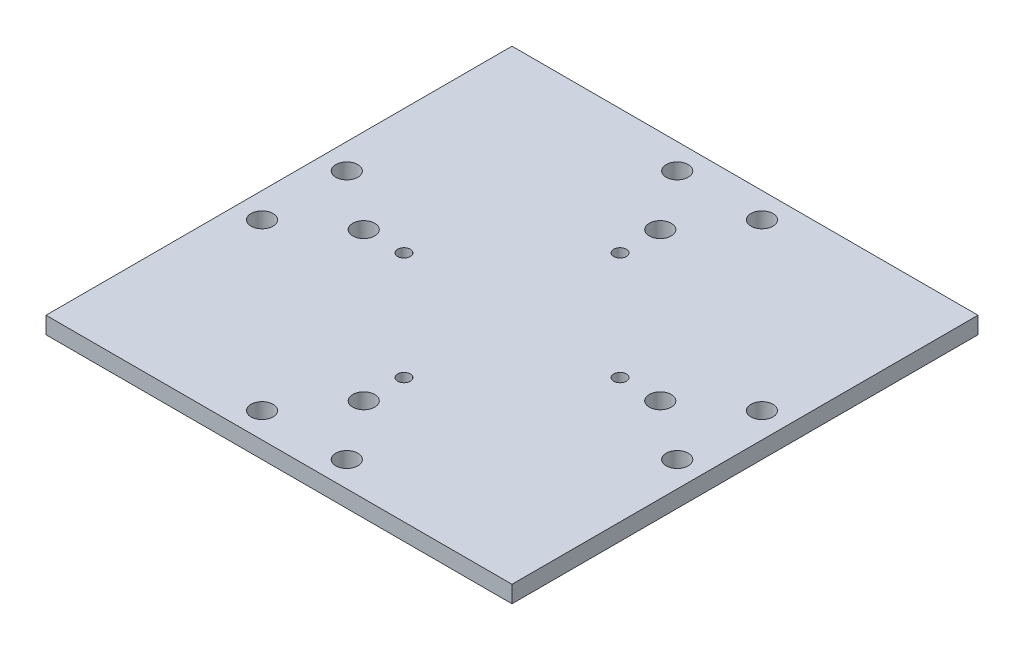
ISO-10303-21;
HEADER;
FILE_DESCRIPTION(('STEP AP214'),'2;1');
FILE_NAME('part.step','',(''),(''),'','','');
FILE_SCHEMA(('AUTOMOTIVE_DESIGN { 1 0 10303 214 1 1 1 1 }'));
ENDSEC;
DATA;
#1=APPLICATION_CONTEXT('core data for automotive mechanical design processes');
#2=APPLICATION_PROTOCOL_DEFINITION('international standard','automotive_design',2000,#1);
#3=PRODUCT_CONTEXT('',#1,'mechanical');
#4=PRODUCT('Part','Part','',(#3));
#5=PRODUCT_RELATED_PRODUCT_CATEGORY('part','',(#4));
#6=PRODUCT_DEFINITION_FORMATION('','',#4);
#7=PRODUCT_DEFINITION_CONTEXT('part definition',#1,'design');
#8=PRODUCT_DEFINITION('design','',#6,#7);
#9=PRODUCT_DEFINITION_SHAPE('','',#8);
#10=(LENGTH_UNIT() NAMED_UNIT(*) SI_UNIT(.MILLI.,.METRE.));
#11=(NAMED_UNIT(*) PLANE_ANGLE_UNIT() SI_UNIT($,.RADIAN.));
#12=(NAMED_UNIT(*) SI_UNIT($,.STERADIAN.) SOLID_ANGLE_UNIT());
#13=UNCERTAINTY_MEASURE_WITH_UNIT(LENGTH_MEASURE(1.E-05),#10,'distance_accuracy_value','');
#14=(GEOMETRIC_REPRESENTATION_CONTEXT(3) GLOBAL_UNCERTAINTY_ASSIGNED_CONTEXT((#13)) GLOBAL_UNIT_ASSIGNED_CONTEXT((#10,
#11,#12)) REPRESENTATION_CONTEXT('',''));
#15=CARTESIAN_POINT('',(0.,0.,0.));
#16=DIRECTION('',(0.,0.,1.));
#17=DIRECTION('',(1.,0.,0.));
#18=AXIS2_PLACEMENT_3D('',#15,#16,#17);
#19=CARTESIAN_POINT('',(55.,4.,55.));
#20=DIRECTION('',(-1.,0.,0.));
#21=DIRECTION('',(0.,0.,1.));
#22=AXIS2_PLACEMENT_3D('',#19,#20,#21);
#23=PLANE('',#22);
#24=DIRECTION('',(0.,0.,-1.));
#25=VECTOR('',#24,1.);
#26=CARTESIAN_POINT('',(55.,0.,55.));
#27=LINE('',#26,#25);
#28=CARTESIAN_POINT('',(55.,0.,55.));
#29=VERTEX_POINT('',#28);
#30=CARTESIAN_POINT('',(55.,0.,-55.));
#31=VERTEX_POINT('',#30);
#32=EDGE_CURVE('E99',#29,#31,#27,.T.);
#33=ORIENTED_EDGE('',*,*,#32,.T.);
#34=DIRECTION('',(0.,-1.,0.));
#35=VECTOR('',#34,1.);
#36=CARTESIAN_POINT('',(55.,4.,-55.));
#37=LINE('',#36,#35);
#38=CARTESIAN_POINT('',(55.,4.,-55.));
#39=VERTEX_POINT('',#38);
#40=EDGE_CURVE('E11',#39,#31,#37,.T.);
#41=ORIENTED_EDGE('',*,*,#40,.F.);
#42=DIRECTION('',(0.,0.,-1.));
#43=VECTOR('',#42,1.);
#44=CARTESIAN_POINT('',(55.,4.,55.));
#45=LINE('',#44,#43);
#46=CARTESIAN_POINT('',(55.,4.,55.));
#47=VERTEX_POINT('',#46);
#48=EDGE_CURVE('E87',#47,#39,#45,.T.);
#49=ORIENTED_EDGE('',*,*,#48,.F.);
#50=DIRECTION('',(0.,-1.,0.));
#51=VECTOR('',#50,1.);
#52=CARTESIAN_POINT('',(55.,4.,55.));
#53=LINE('',#52,#51);
#54=EDGE_CURVE('E95',#47,#29,#53,.T.);
#55=ORIENTED_EDGE('',*,*,#54,.T.);
#56=EDGE_LOOP('',(#33,#41,#49,#55));
#57=FACE_BOUND('',#56,.T.);
#58=ADVANCED_FACE('F36',(#57),#23,.F.);
#59=CARTESIAN_POINT('',(55.,4.,-55.));
#60=DIRECTION('',(0.,0.,1.));
#61=DIRECTION('',(1.,0.,0.));
#62=AXIS2_PLACEMENT_3D('',#59,#60,#61);
#63=PLANE('',#62);
#64=DIRECTION('',(-1.,0.,0.));
#65=VECTOR('',#64,1.);
#66=CARTESIAN_POINT('',(55.,0.,-55.));
#67=LINE('',#66,#65);
#68=CARTESIAN_POINT('',(-55.,0.,-55.));
#69=VERTEX_POINT('',#68);
#70=EDGE_CURVE('E91',#31,#69,#67,.T.);
#71=ORIENTED_EDGE('',*,*,#70,.T.);
#72=DIRECTION('',(0.,-1.,0.));
#73=VECTOR('',#72,1.);
#74=CARTESIAN_POINT('',(-55.,4.,-55.));
#75=LINE('',#74,#73);
#76=CARTESIAN_POINT('',(-55.,4.,-55.));
#77=VERTEX_POINT('',#76);
#78=EDGE_CURVE('E44',#77,#69,#75,.T.);
#79=ORIENTED_EDGE('',*,*,#78,.F.);
#80=DIRECTION('',(-1.,0.,0.));
#81=VECTOR('',#80,1.);
#82=CARTESIAN_POINT('',(55.,4.,-55.));
#83=LINE('',#82,#81);
#84=EDGE_CURVE('E82',#39,#77,#83,.T.);
#85=ORIENTED_EDGE('',*,*,#84,.F.);
#86=ORIENTED_EDGE('',*,*,#40,.T.);
#87=EDGE_LOOP('',(#71,#79,#85,#86));
#88=FACE_BOUND('',#87,.T.);
#89=ADVANCED_FACE('F90',(#88),#63,.F.);
#90=CARTESIAN_POINT('',(-55.,4.,-55.));
#91=DIRECTION('',(1.,0.,0.));
#92=DIRECTION('',(0.,0.,-1.));
#93=AXIS2_PLACEMENT_3D('',#90,#91,#92);
#94=PLANE('',#93);
#95=DIRECTION('',(0.,0.,1.));
#96=VECTOR('',#95,1.);
#97=CARTESIAN_POINT('',(-55.,0.,-55.));
#98=LINE('',#97,#96);
#99=CARTESIAN_POINT('',(-55.,0.,55.));
#100=VERTEX_POINT('',#99);
#101=EDGE_CURVE('E69',#69,#100,#98,.T.);
#102=ORIENTED_EDGE('',*,*,#101,.T.);
#103=DIRECTION('',(0.,-1.,0.));
#104=VECTOR('',#103,1.);
#105=CARTESIAN_POINT('',(-55.,4.,55.));
#106=LINE('',#105,#104);
#107=CARTESIAN_POINT('',(-55.,4.,55.));
#108=VERTEX_POINT('',#107);
#109=EDGE_CURVE('E92',#108,#100,#106,.T.);
#110=ORIENTED_EDGE('',*,*,#109,.F.);
#111=DIRECTION('',(0.,0.,1.));
#112=VECTOR('',#111,1.);
#113=CARTESIAN_POINT('',(-55.,4.,-55.));
#114=LINE('',#113,#112);
#115=EDGE_CURVE('E85',#77,#108,#114,.T.);
#116=ORIENTED_EDGE('',*,*,#115,.F.);
#117=ORIENTED_EDGE('',*,*,#78,.T.);
#118=EDGE_LOOP('',(#102,#110,#116,#117));
#119=FACE_BOUND('',#118,.T.);
#120=ADVANCED_FACE('F93',(#119),#94,.F.);
#121=CARTESIAN_POINT('',(-55.,4.,55.));
#122=DIRECTION('',(0.,0.,-1.));
#123=DIRECTION('',(-1.,0.,0.));
#124=AXIS2_PLACEMENT_3D('',#121,#122,#123);
#125=PLANE('',#124);
#126=DIRECTION('',(1.,0.,0.));
#127=VECTOR('',#126,1.);
#128=CARTESIAN_POINT('',(-55.,0.,55.));
#129=LINE('',#128,#127);
#130=EDGE_CURVE('E75',#100,#29,#129,.T.);
#131=ORIENTED_EDGE('',*,*,#130,.T.);
#132=ORIENTED_EDGE('',*,*,#54,.F.);
#133=DIRECTION('',(1.,0.,0.));
#134=VECTOR('',#133,1.);
#135=CARTESIAN_POINT('',(-55.,4.,55.));
#136=LINE('',#135,#134);
#137=EDGE_CURVE('E52',#108,#47,#136,.T.);
#138=ORIENTED_EDGE('',*,*,#137,.F.);
#139=ORIENTED_EDGE('',*,*,#109,.T.);
#140=EDGE_LOOP('',(#131,#132,#138,#139));
#141=FACE_BOUND('',#140,.T.);
#142=ADVANCED_FACE('F107',(#141),#125,.F.);
#143=CARTESIAN_POINT('',(0.,4.,0.));
#144=DIRECTION('',(0.,1.,0.));
#145=DIRECTION('',(0.,0.,1.));
#146=AXIS2_PLACEMENT_3D('',#143,#144,#145);
#147=PLANE('',#146);
#148=CARTESIAN_POINT('',(-48.9999999999963,4.,-9.99999999999861));
#149=DIRECTION('',(0.,1.,0.));
#150=DIRECTION('',(0.,0.,1.));
#151=AXIS2_PLACEMENT_3D('',#148,#149,#150);
#152=CIRCLE('',#151,2.6);
#153=CARTESIAN_POINT('',(-48.9999999999963,4.,-7.39999999999862));
#154=VERTEX_POINT('',#153);
#155=EDGE_CURVE('E167',#154,#154,#152,.T.);
#156=ORIENTED_EDGE('',*,*,#155,.F.);
#157=EDGE_LOOP('',(#156));
#158=FACE_BOUND('',#157,.T.);
#159=CARTESIAN_POINT('',(-48.9999999999963,4.,10.0000000000014));
#160=DIRECTION('',(0.,1.,0.));
#161=DIRECTION('',(0.,0.,1.));
#162=AXIS2_PLACEMENT_3D('',#159,#160,#161);
#163=CIRCLE('',#162,2.6);
#164=CARTESIAN_POINT('',(-48.9999999999963,4.,12.6000000000014));
#165=VERTEX_POINT('',#164);
#166=EDGE_CURVE('E173',#165,#165,#163,.T.);
#167=ORIENTED_EDGE('',*,*,#166,.F.);
#168=EDGE_LOOP('',(#167));
#169=FACE_BOUND('',#168,.T.);
#170=CARTESIAN_POINT('',(-9.99999999999496,4.,48.9999999999977));
#171=DIRECTION('',(0.,1.,0.));
#172=DIRECTION('',(0.,0.,1.));
#173=AXIS2_PLACEMENT_3D('',#170,#171,#172);
#174=CIRCLE('',#173,2.6);
#175=CARTESIAN_POINT('',(-9.99999999999496,4.,51.5999999999977));
#176=VERTEX_POINT('',#175);
#177=EDGE_CURVE('E179',#176,#176,#174,.T.);
#178=ORIENTED_EDGE('',*,*,#177,.F.);
#179=EDGE_LOOP('',(#178));
#180=FACE_BOUND('',#179,.T.);
#181=CARTESIAN_POINT('',(10.000000000005,4.,48.9999999999977));
#182=DIRECTION('',(0.,1.,0.));
#183=DIRECTION('',(0.,0.,1.));
#184=AXIS2_PLACEMENT_3D('',#181,#182,#183);
#185=CIRCLE('',#184,2.6);
#186=CARTESIAN_POINT('',(10.000000000005,4.,51.5999999999977));
#187=VERTEX_POINT('',#186);
#188=EDGE_CURVE('E185',#187,#187,#185,.T.);
#189=ORIENTED_EDGE('',*,*,#188,.F.);
#190=EDGE_LOOP('',(#189));
#191=FACE_BOUND('',#190,.T.);
#192=CARTESIAN_POINT('',(49.0000000000014,4.,9.99999999999634));
#193=DIRECTION('',(0.,1.,0.));
#194=DIRECTION('',(0.,0.,1.));
#195=AXIS2_PLACEMENT_3D('',#192,#193,#194);
#196=CIRCLE('',#195,2.6);
#197=CARTESIAN_POINT('',(49.0000000000014,4.,12.5999999999963));
#198=VERTEX_POINT('',#197);
#199=EDGE_CURVE('E191',#198,#198,#196,.T.);
#200=ORIENTED_EDGE('',*,*,#199,.F.);
#201=EDGE_LOOP('',(#200));
#202=FACE_BOUND('',#201,.T.);
#203=CARTESIAN_POINT('',(49.0000000000014,4.,-10.0000000000037));
#204=DIRECTION('',(0.,1.,0.));
#205=DIRECTION('',(0.,0.,1.));
#206=AXIS2_PLACEMENT_3D('',#203,#204,#205);
#207=CIRCLE('',#206,2.6);
#208=CARTESIAN_POINT('',(49.0000000000014,4.,-7.40000000000366));
#209=VERTEX_POINT('',#208);
#210=EDGE_CURVE('E197',#209,#209,#207,.T.);
#211=ORIENTED_EDGE('',*,*,#210,.F.);
#212=EDGE_LOOP('',(#211));
#213=FACE_BOUND('',#212,.T.);
#214=CARTESIAN_POINT('',(10.,4.,-49.));
#215=DIRECTION('',(0.,1.,0.));
#216=DIRECTION('',(0.,0.,1.));
#217=AXIS2_PLACEMENT_3D('',#214,#215,#216);
#218=CIRCLE('',#217,2.6);
#219=CARTESIAN_POINT('',(10.,4.,-46.4));
#220=VERTEX_POINT('',#219);
#221=EDGE_CURVE('E203',#220,#220,#218,.T.);
#222=ORIENTED_EDGE('',*,*,#221,.F.);
#223=EDGE_LOOP('',(#222));
#224=FACE_BOUND('',#223,.T.);
#225=CARTESIAN_POINT('',(-10.,4.,-49.));
#226=DIRECTION('',(0.,1.,0.));
#227=DIRECTION('',(0.,0.,1.));
#228=AXIS2_PLACEMENT_3D('',#225,#226,#227);
#229=CIRCLE('',#228,2.6);
#230=CARTESIAN_POINT('',(-10.,4.,-46.4));
#231=VERTEX_POINT('',#230);
#232=EDGE_CURVE('E161',#231,#231,#229,.T.);
#233=ORIENTED_EDGE('',*,*,#232,.F.);
#234=EDGE_LOOP('',(#233));
#235=FACE_BOUND('',#234,.T.);
#236=CARTESIAN_POINT('',(0.,4.,-25.5));
#237=DIRECTION('',(0.,1.,0.));
#238=DIRECTION('',(0.,0.,1.));
#239=AXIS2_PLACEMENT_3D('',#236,#237,#238);
#240=CIRCLE('',#239,1.5);
#241=CARTESIAN_POINT('',(0.,4.,-24.));
#242=VERTEX_POINT('',#241);
#243=EDGE_CURVE('E156',#242,#242,#240,.T.);
#244=ORIENTED_EDGE('',*,*,#243,.F.);
#245=EDGE_LOOP('',(#244));
#246=FACE_BOUND('',#245,.T.);
#247=CARTESIAN_POINT('',(25.5000000000004,4.,-3.60815370568738E-13));
#248=DIRECTION('',(0.,1.,0.));
#249=DIRECTION('',(0.,0.,1.));
#250=AXIS2_PLACEMENT_3D('',#247,#248,#249);
#251=CIRCLE('',#250,1.5);
#252=CARTESIAN_POINT('',(25.5000000000004,4.,1.49999999999964));
#253=VERTEX_POINT('',#252);
#254=EDGE_CURVE('E150',#253,#253,#251,.T.);
#255=ORIENTED_EDGE('',*,*,#254,.F.);
#256=EDGE_LOOP('',(#255));
#257=FACE_BOUND('',#256,.T.);
#258=CARTESIAN_POINT('',(7.21630741137477E-13,4.,25.5));
#259=DIRECTION('',(0.,1.,0.));
#260=DIRECTION('',(0.,0.,1.));
#261=AXIS2_PLACEMENT_3D('',#258,#259,#260);
#262=CIRCLE('',#261,1.5);
#263=CARTESIAN_POINT('',(7.21630741137477E-13,4.,27.));
#264=VERTEX_POINT('',#263);
#265=EDGE_CURVE('E144',#264,#264,#262,.T.);
#266=ORIENTED_EDGE('',*,*,#265,.F.);
#267=EDGE_LOOP('',(#266));
#268=FACE_BOUND('',#267,.T.);
#269=CARTESIAN_POINT('',(-25.4999999999996,4.,3.63938219906564E-13));
#270=DIRECTION('',(0.,1.,0.));
#271=DIRECTION('',(0.,0.,1.));
#272=AXIS2_PLACEMENT_3D('',#269,#270,#271);
#273=CIRCLE('',#272,1.5);
#274=CARTESIAN_POINT('',(-25.4999999999996,4.,1.50000000000036));
#275=VERTEX_POINT('',#274);
#276=EDGE_CURVE('E137',#275,#275,#273,.T.);
#277=ORIENTED_EDGE('',*,*,#276,.F.);
#278=EDGE_LOOP('',(#277));
#279=FACE_BOUND('',#278,.T.);
#280=CARTESIAN_POINT('',(1.17915583062494E-13,4.,-35.));
#281=DIRECTION('',(0.,1.,0.));
#282=DIRECTION('',(0.,0.,1.));
#283=AXIS2_PLACEMENT_3D('',#280,#281,#282);
#284=CIRCLE('',#283,2.6);
#285=CARTESIAN_POINT('',(1.17915583062494E-13,4.,-32.4));
#286=VERTEX_POINT('',#285);
#287=EDGE_CURVE('E102',#286,#286,#284,.T.);
#288=ORIENTED_EDGE('',*,*,#287,.F.);
#289=EDGE_LOOP('',(#288));
#290=FACE_BOUND('',#289,.T.);
#291=CARTESIAN_POINT('',(35.,4.,-2.25968073603445E-13));
#292=DIRECTION('',(0.,1.,0.));
#293=DIRECTION('',(0.,0.,1.));
#294=AXIS2_PLACEMENT_3D('',#291,#292,#293);
#295=CIRCLE('',#294,2.6);
#296=CARTESIAN_POINT('',(35.,4.,2.59999999999977));
#297=VERTEX_POINT('',#296);
#298=EDGE_CURVE('E129',#297,#297,#295,.T.);
#299=ORIENTED_EDGE('',*,*,#298,.F.);
#300=EDGE_LOOP('',(#299));
#301=FACE_BOUND('',#300,.T.);
#302=CARTESIAN_POINT('',(2.26376482025976E-13,4.,34.9999999999997));
#303=DIRECTION('',(0.,1.,0.));
#304=DIRECTION('',(0.,0.,1.));
#305=AXIS2_PLACEMENT_3D('',#302,#303,#304);
#306=CIRCLE('',#305,2.6);
#307=CARTESIAN_POINT('',(2.26376482025976E-13,4.,37.5999999999997));
#308=VERTEX_POINT('',#307);
#309=EDGE_CURVE('E123',#308,#308,#306,.T.);
#310=ORIENTED_EDGE('',*,*,#309,.F.);
#311=EDGE_LOOP('',(#310));
#312=FACE_BOUND('',#311,.T.);
#313=CARTESIAN_POINT('',(-34.9999999999997,4.,-1.13220910842947E-13));
#314=DIRECTION('',(0.,1.,0.));
#315=DIRECTION('',(0.,0.,1.));
#316=AXIS2_PLACEMENT_3D('',#313,#314,#315);
#317=CIRCLE('',#316,2.6);
#318=CARTESIAN_POINT('',(-34.9999999999997,4.,2.59999999999988));
#319=VERTEX_POINT('',#318);
#320=EDGE_CURVE('E116',#319,#319,#317,.T.);
#321=ORIENTED_EDGE('',*,*,#320,.F.);
#322=EDGE_LOOP('',(#321));
#323=FACE_BOUND('',#322,.T.);
#324=ORIENTED_EDGE('',*,*,#48,.T.);
#325=ORIENTED_EDGE('',*,*,#84,.T.);
#326=ORIENTED_EDGE('',*,*,#115,.T.);
#327=ORIENTED_EDGE('',*,*,#137,.T.);
#328=EDGE_LOOP('',(#324,#325,#326,#327));
#329=FACE_BOUND('',#328,.T.);
#330=ADVANCED_FACE('F83',(#158,#169,#180,#191,#202,#213,#224,#235,#246,#257,#268,#279,#290,#301,
#312,#323,#329),#147,.T.);
#331=CARTESIAN_POINT('',(0.,0.,0.));
#332=DIRECTION('',(0.,1.,0.));
#333=DIRECTION('',(0.,0.,1.));
#334=AXIS2_PLACEMENT_3D('',#331,#332,#333);
#335=PLANE('',#334);
#336=CARTESIAN_POINT('',(-48.9999999999963,0.,-9.99999999999861));
#337=DIRECTION('',(0.,1.,0.));
#338=DIRECTION('',(0.,0.,1.));
#339=AXIS2_PLACEMENT_3D('',#336,#337,#338);
#340=CIRCLE('',#339,2.6);
#341=CARTESIAN_POINT('',(-48.9999999999963,0.,-7.39999999999862));
#342=VERTEX_POINT('',#341);
#343=EDGE_CURVE('E170',#342,#342,#340,.T.);
#344=ORIENTED_EDGE('',*,*,#343,.T.);
#345=EDGE_LOOP('',(#344));
#346=FACE_BOUND('',#345,.T.);
#347=CARTESIAN_POINT('',(-48.9999999999963,0.,10.0000000000014));
#348=DIRECTION('',(0.,1.,0.));
#349=DIRECTION('',(0.,0.,1.));
#350=AXIS2_PLACEMENT_3D('',#347,#348,#349);
#351=CIRCLE('',#350,2.6);
#352=CARTESIAN_POINT('',(-48.9999999999963,0.,12.6000000000014));
#353=VERTEX_POINT('',#352);
#354=EDGE_CURVE('E176',#353,#353,#351,.T.);
#355=ORIENTED_EDGE('',*,*,#354,.T.);
#356=EDGE_LOOP('',(#355));
#357=FACE_BOUND('',#356,.T.);
#358=CARTESIAN_POINT('',(-9.99999999999496,0.,48.9999999999977));
#359=DIRECTION('',(0.,1.,0.));
#360=DIRECTION('',(0.,0.,1.));
#361=AXIS2_PLACEMENT_3D('',#358,#359,#360);
#362=CIRCLE('',#361,2.6);
#363=CARTESIAN_POINT('',(-9.99999999999496,0.,51.5999999999977));
#364=VERTEX_POINT('',#363);
#365=EDGE_CURVE('E182',#364,#364,#362,.T.);
#366=ORIENTED_EDGE('',*,*,#365,.T.);
#367=EDGE_LOOP('',(#366));
#368=FACE_BOUND('',#367,.T.);
#369=CARTESIAN_POINT('',(10.000000000005,0.,48.9999999999977));
#370=DIRECTION('',(0.,1.,0.));
#371=DIRECTION('',(0.,0.,1.));
#372=AXIS2_PLACEMENT_3D('',#369,#370,#371);
#373=CIRCLE('',#372,2.6);
#374=CARTESIAN_POINT('',(10.000000000005,0.,51.5999999999977));
#375=VERTEX_POINT('',#374);
#376=EDGE_CURVE('E188',#375,#375,#373,.T.);
#377=ORIENTED_EDGE('',*,*,#376,.T.);
#378=EDGE_LOOP('',(#377));
#379=FACE_BOUND('',#378,.T.);
#380=CARTESIAN_POINT('',(49.0000000000014,0.,9.99999999999634));
#381=DIRECTION('',(0.,1.,0.));
#382=DIRECTION('',(0.,0.,1.));
#383=AXIS2_PLACEMENT_3D('',#380,#381,#382);
#384=CIRCLE('',#383,2.6);
#385=CARTESIAN_POINT('',(49.0000000000014,0.,12.5999999999963));
#386=VERTEX_POINT('',#385);
#387=EDGE_CURVE('E194',#386,#386,#384,.T.);
#388=ORIENTED_EDGE('',*,*,#387,.T.);
#389=EDGE_LOOP('',(#388));
#390=FACE_BOUND('',#389,.T.);
#391=CARTESIAN_POINT('',(49.0000000000014,0.,-10.0000000000037));
#392=DIRECTION('',(0.,1.,0.));
#393=DIRECTION('',(0.,0.,1.));
#394=AXIS2_PLACEMENT_3D('',#391,#392,#393);
#395=CIRCLE('',#394,2.6);
#396=CARTESIAN_POINT('',(49.0000000000014,0.,-7.40000000000366));
#397=VERTEX_POINT('',#396);
#398=EDGE_CURVE('E200',#397,#397,#395,.T.);
#399=ORIENTED_EDGE('',*,*,#398,.T.);
#400=EDGE_LOOP('',(#399));
#401=FACE_BOUND('',#400,.T.);
#402=CARTESIAN_POINT('',(10.,0.,-49.));
#403=DIRECTION('',(0.,1.,0.));
#404=DIRECTION('',(0.,0.,1.));
#405=AXIS2_PLACEMENT_3D('',#402,#403,#404);
#406=CIRCLE('',#405,2.6);
#407=CARTESIAN_POINT('',(10.,0.,-46.4));
#408=VERTEX_POINT('',#407);
#409=EDGE_CURVE('E164',#408,#408,#406,.T.);
#410=ORIENTED_EDGE('',*,*,#409,.T.);
#411=EDGE_LOOP('',(#410));
#412=FACE_BOUND('',#411,.T.);
#413=CARTESIAN_POINT('',(-10.,0.,-49.));
#414=DIRECTION('',(0.,1.,0.));
#415=DIRECTION('',(0.,0.,1.));
#416=AXIS2_PLACEMENT_3D('',#413,#414,#415);
#417=CIRCLE('',#416,2.6);
#418=CARTESIAN_POINT('',(-10.,0.,-46.4));
#419=VERTEX_POINT('',#418);
#420=EDGE_CURVE('E141',#419,#419,#417,.T.);
#421=ORIENTED_EDGE('',*,*,#420,.T.);
#422=EDGE_LOOP('',(#421));
#423=FACE_BOUND('',#422,.T.);
#424=CARTESIAN_POINT('',(0.,0.,-25.5));
#425=DIRECTION('',(0.,1.,0.));
#426=DIRECTION('',(0.,0.,1.));
#427=AXIS2_PLACEMENT_3D('',#424,#425,#426);
#428=CIRCLE('',#427,1.5);
#429=CARTESIAN_POINT('',(0.,0.,-24.));
#430=VERTEX_POINT('',#429);
#431=EDGE_CURVE('E117',#430,#430,#428,.T.);
#432=ORIENTED_EDGE('',*,*,#431,.T.);
#433=EDGE_LOOP('',(#432));
#434=FACE_BOUND('',#433,.T.);
#435=CARTESIAN_POINT('',(25.5000000000004,0.,-3.60815370568738E-13));
#436=DIRECTION('',(0.,1.,0.));
#437=DIRECTION('',(0.,0.,1.));
#438=AXIS2_PLACEMENT_3D('',#435,#436,#437);
#439=CIRCLE('',#438,1.5);
#440=CARTESIAN_POINT('',(25.5000000000004,0.,1.49999999999964));
#441=VERTEX_POINT('',#440);
#442=EDGE_CURVE('E153',#441,#441,#439,.T.);
#443=ORIENTED_EDGE('',*,*,#442,.T.);
#444=EDGE_LOOP('',(#443));
#445=FACE_BOUND('',#444,.T.);
#446=CARTESIAN_POINT('',(7.21630741137477E-13,0.,25.5));
#447=DIRECTION('',(0.,1.,0.));
#448=DIRECTION('',(0.,0.,1.));
#449=AXIS2_PLACEMENT_3D('',#446,#447,#448);
#450=CIRCLE('',#449,1.5);
#451=CARTESIAN_POINT('',(7.21630741137477E-13,0.,27.));
#452=VERTEX_POINT('',#451);
#453=EDGE_CURVE('E147',#452,#452,#450,.T.);
#454=ORIENTED_EDGE('',*,*,#453,.T.);
#455=EDGE_LOOP('',(#454));
#456=FACE_BOUND('',#455,.T.);
#457=CARTESIAN_POINT('',(-25.4999999999996,0.,3.63938219906564E-13));
#458=DIRECTION('',(0.,1.,0.));
#459=DIRECTION('',(0.,0.,1.));
#460=AXIS2_PLACEMENT_3D('',#457,#458,#459);
#461=CIRCLE('',#460,1.5);
#462=CARTESIAN_POINT('',(-25.4999999999996,0.,1.50000000000036));
#463=VERTEX_POINT('',#462);
#464=EDGE_CURVE('E140',#463,#463,#461,.T.);
#465=ORIENTED_EDGE('',*,*,#464,.T.);
#466=EDGE_LOOP('',(#465));
#467=FACE_BOUND('',#466,.T.);
#468=CARTESIAN_POINT('',(1.17915583062494E-13,0.,-35.));
#469=DIRECTION('',(0.,1.,0.));
#470=DIRECTION('',(0.,0.,1.));
#471=AXIS2_PLACEMENT_3D('',#468,#469,#470);
#472=CIRCLE('',#471,2.6);
#473=CARTESIAN_POINT('',(1.17915583062494E-13,0.,-32.4));
#474=VERTEX_POINT('',#473);
#475=EDGE_CURVE('E132',#474,#474,#472,.T.);
#476=ORIENTED_EDGE('',*,*,#475,.T.);
#477=EDGE_LOOP('',(#476));
#478=FACE_BOUND('',#477,.T.);
#479=CARTESIAN_POINT('',(35.,0.,-2.25968073603445E-13));
#480=DIRECTION('',(0.,1.,0.));
#481=DIRECTION('',(0.,0.,1.));
#482=AXIS2_PLACEMENT_3D('',#479,#480,#481);
#483=CIRCLE('',#482,2.6);
#484=CARTESIAN_POINT('',(35.,0.,2.59999999999977));
#485=VERTEX_POINT('',#484);
#486=EDGE_CURVE('E126',#485,#485,#483,.T.);
#487=ORIENTED_EDGE('',*,*,#486,.T.);
#488=EDGE_LOOP('',(#487));
#489=FACE_BOUND('',#488,.T.);
#490=CARTESIAN_POINT('',(2.26376482025976E-13,0.,34.9999999999997));
#491=DIRECTION('',(0.,1.,0.));
#492=DIRECTION('',(0.,0.,1.));
#493=AXIS2_PLACEMENT_3D('',#490,#491,#492);
#494=CIRCLE('',#493,2.6);
#495=CARTESIAN_POINT('',(2.26376482025976E-13,0.,37.5999999999997));
#496=VERTEX_POINT('',#495);
#497=EDGE_CURVE('E120',#496,#496,#494,.T.);
#498=ORIENTED_EDGE('',*,*,#497,.T.);
#499=EDGE_LOOP('',(#498));
#500=FACE_BOUND('',#499,.T.);
#501=CARTESIAN_POINT('',(-34.9999999999997,0.,-1.13220910842947E-13));
#502=DIRECTION('',(0.,1.,0.));
#503=DIRECTION('',(0.,0.,1.));
#504=AXIS2_PLACEMENT_3D('',#501,#502,#503);
#505=CIRCLE('',#504,2.6);
#506=CARTESIAN_POINT('',(-34.9999999999997,0.,2.59999999999988));
#507=VERTEX_POINT('',#506);
#508=EDGE_CURVE('E113',#507,#507,#505,.T.);
#509=ORIENTED_EDGE('',*,*,#508,.T.);
#510=EDGE_LOOP('',(#509));
#511=FACE_BOUND('',#510,.T.);
#512=ORIENTED_EDGE('',*,*,#32,.F.);
#513=ORIENTED_EDGE('',*,*,#130,.F.);
#514=ORIENTED_EDGE('',*,*,#101,.F.);
#515=ORIENTED_EDGE('',*,*,#70,.F.);
#516=EDGE_LOOP('',(#512,#513,#514,#515));
#517=FACE_BOUND('',#516,.T.);
#518=ADVANCED_FACE('F110',(#346,#357,#368,#379,#390,#401,#412,#423,#434,#445,#456,#467,#478,
#489,#500,#511,#517),#335,.F.);
#519=CARTESIAN_POINT('',(-34.9999999999997,4.,-1.13220910842947E-13));
#520=DIRECTION('',(0.,-1.,0.));
#521=DIRECTION('',(0.,0.,-1.));
#522=AXIS2_PLACEMENT_3D('',#519,#520,#521);
#523=CYLINDRICAL_SURFACE('',#522,2.6);
#524=ORIENTED_EDGE('',*,*,#320,.T.);
#525=EDGE_LOOP('',(#524));
#526=FACE_BOUND('',#525,.T.);
#527=ORIENTED_EDGE('',*,*,#508,.F.);
#528=EDGE_LOOP('',(#527));
#529=FACE_BOUND('',#528,.T.);
#530=ADVANCED_FACE('F241',(#526,#529),#523,.F.);
#531=CARTESIAN_POINT('',(2.26376482025976E-13,4.,34.9999999999997));
#532=DIRECTION('',(0.,-1.,0.));
#533=DIRECTION('',(0.,0.,-1.));
#534=AXIS2_PLACEMENT_3D('',#531,#532,#533);
#535=CYLINDRICAL_SURFACE('',#534,2.6);
#536=ORIENTED_EDGE('',*,*,#309,.T.);
#537=EDGE_LOOP('',(#536));
#538=FACE_BOUND('',#537,.T.);
#539=ORIENTED_EDGE('',*,*,#497,.F.);
#540=EDGE_LOOP('',(#539));
#541=FACE_BOUND('',#540,.T.);
#542=ADVANCED_FACE('F244',(#538,#541),#535,.F.);
#543=CARTESIAN_POINT('',(35.,4.,-2.25968073603445E-13));
#544=DIRECTION('',(0.,-1.,0.));
#545=DIRECTION('',(0.,0.,-1.));
#546=AXIS2_PLACEMENT_3D('',#543,#544,#545);
#547=CYLINDRICAL_SURFACE('',#546,2.6);
#548=ORIENTED_EDGE('',*,*,#298,.T.);
#549=EDGE_LOOP('',(#548));
#550=FACE_BOUND('',#549,.T.);
#551=ORIENTED_EDGE('',*,*,#486,.F.);
#552=EDGE_LOOP('',(#551));
#553=FACE_BOUND('',#552,.T.);
#554=ADVANCED_FACE('F382',(#550,#553),#547,.F.);
#555=CARTESIAN_POINT('',(1.17915583062494E-13,4.,-35.));
#556=DIRECTION('',(0.,-1.,0.));
#557=DIRECTION('',(0.,0.,-1.));
#558=AXIS2_PLACEMENT_3D('',#555,#556,#557);
#559=CYLINDRICAL_SURFACE('',#558,2.6);
#560=ORIENTED_EDGE('',*,*,#287,.T.);
#561=EDGE_LOOP('',(#560));
#562=FACE_BOUND('',#561,.T.);
#563=ORIENTED_EDGE('',*,*,#475,.F.);
#564=EDGE_LOOP('',(#563));
#565=FACE_BOUND('',#564,.T.);
#566=ADVANCED_FACE('F378',(#562,#565),#559,.F.);
#567=CARTESIAN_POINT('',(-25.4999999999996,0.,3.63938219906564E-13));
#568=DIRECTION('',(0.,1.,0.));
#569=DIRECTION('',(0.,0.,1.));
#570=AXIS2_PLACEMENT_3D('',#567,#568,#569);
#571=CYLINDRICAL_SURFACE('',#570,1.5);
#572=ORIENTED_EDGE('',*,*,#464,.F.);
#573=EDGE_LOOP('',(#572));
#574=FACE_BOUND('',#573,.T.);
#575=ORIENTED_EDGE('',*,*,#276,.T.);
#576=EDGE_LOOP('',(#575));
#577=FACE_BOUND('',#576,.T.);
#578=ADVANCED_FACE('F374',(#574,#577),#571,.F.);
#579=CARTESIAN_POINT('',(7.21630741137477E-13,0.,25.5));
#580=DIRECTION('',(0.,1.,0.));
#581=DIRECTION('',(0.,0.,1.));
#582=AXIS2_PLACEMENT_3D('',#579,#580,#581);
#583=CYLINDRICAL_SURFACE('',#582,1.5);
#584=ORIENTED_EDGE('',*,*,#453,.F.);
#585=EDGE_LOOP('',(#584));
#586=FACE_BOUND('',#585,.T.);
#587=ORIENTED_EDGE('',*,*,#265,.T.);
#588=EDGE_LOOP('',(#587));
#589=FACE_BOUND('',#588,.T.);
#590=ADVANCED_FACE('F370',(#586,#589),#583,.F.);
#591=CARTESIAN_POINT('',(25.5000000000004,0.,-3.60815370568738E-13));
#592=DIRECTION('',(0.,1.,0.));
#593=DIRECTION('',(0.,0.,1.));
#594=AXIS2_PLACEMENT_3D('',#591,#592,#593);
#595=CYLINDRICAL_SURFACE('',#594,1.5);
#596=ORIENTED_EDGE('',*,*,#442,.F.);
#597=EDGE_LOOP('',(#596));
#598=FACE_BOUND('',#597,.T.);
#599=ORIENTED_EDGE('',*,*,#254,.T.);
#600=EDGE_LOOP('',(#599));
#601=FACE_BOUND('',#600,.T.);
#602=ADVANCED_FACE('F366',(#598,#601),#595,.F.);
#603=CARTESIAN_POINT('',(0.,0.,-25.5));
#604=DIRECTION('',(0.,1.,0.));
#605=DIRECTION('',(0.,0.,1.));
#606=AXIS2_PLACEMENT_3D('',#603,#604,#605);
#607=CYLINDRICAL_SURFACE('',#606,1.5);
#608=ORIENTED_EDGE('',*,*,#431,.F.);
#609=EDGE_LOOP('',(#608));
#610=FACE_BOUND('',#609,.T.);
#611=ORIENTED_EDGE('',*,*,#243,.T.);
#612=EDGE_LOOP('',(#611));
#613=FACE_BOUND('',#612,.T.);
#614=ADVANCED_FACE('F279',(#610,#613),#607,.F.);
#615=CARTESIAN_POINT('',(-10.,0.,-49.));
#616=DIRECTION('',(0.,1.,0.));
#617=DIRECTION('',(0.,0.,1.));
#618=AXIS2_PLACEMENT_3D('',#615,#616,#617);
#619=CYLINDRICAL_SURFACE('',#618,2.6);
#620=ORIENTED_EDGE('',*,*,#420,.F.);
#621=EDGE_LOOP('',(#620));
#622=FACE_BOUND('',#621,.T.);
#623=ORIENTED_EDGE('',*,*,#232,.T.);
#624=EDGE_LOOP('',(#623));
#625=FACE_BOUND('',#624,.T.);
#626=ADVANCED_FACE('F215',(#622,#625),#619,.F.);
#627=CARTESIAN_POINT('',(10.,0.,-49.));
#628=DIRECTION('',(0.,1.,0.));
#629=DIRECTION('',(0.,0.,1.));
#630=AXIS2_PLACEMENT_3D('',#627,#628,#629);
#631=CYLINDRICAL_SURFACE('',#630,2.6);
#632=ORIENTED_EDGE('',*,*,#409,.F.);
#633=EDGE_LOOP('',(#632));
#634=FACE_BOUND('',#633,.T.);
#635=ORIENTED_EDGE('',*,*,#221,.T.);
#636=EDGE_LOOP('',(#635));
#637=FACE_BOUND('',#636,.T.);
#638=ADVANCED_FACE('F211',(#634,#637),#631,.F.);
#639=CARTESIAN_POINT('',(49.0000000000014,0.,-10.0000000000037));
#640=DIRECTION('',(0.,1.,0.));
#641=DIRECTION('',(0.,0.,1.));
#642=AXIS2_PLACEMENT_3D('',#639,#640,#641);
#643=CYLINDRICAL_SURFACE('',#642,2.6);
#644=ORIENTED_EDGE('',*,*,#398,.F.);
#645=EDGE_LOOP('',(#644));
#646=FACE_BOUND('',#645,.T.);
#647=ORIENTED_EDGE('',*,*,#210,.T.);
#648=EDGE_LOOP('',(#647));
#649=FACE_BOUND('',#648,.T.);
#650=ADVANCED_FACE('F214',(#646,#649),#643,.F.);
#651=CARTESIAN_POINT('',(49.0000000000014,0.,9.99999999999634));
#652=DIRECTION('',(0.,1.,0.));
#653=DIRECTION('',(0.,0.,1.));
#654=AXIS2_PLACEMENT_3D('',#651,#652,#653);
#655=CYLINDRICAL_SURFACE('',#654,2.6);
#656=ORIENTED_EDGE('',*,*,#387,.F.);
#657=EDGE_LOOP('',(#656));
#658=FACE_BOUND('',#657,.T.);
#659=ORIENTED_EDGE('',*,*,#199,.T.);
#660=EDGE_LOOP('',(#659));
#661=FACE_BOUND('',#660,.T.);
#662=ADVANCED_FACE('F308',(#658,#661),#655,.F.);
#663=CARTESIAN_POINT('',(10.000000000005,0.,48.9999999999977));
#664=DIRECTION('',(0.,1.,0.));
#665=DIRECTION('',(0.,0.,1.));
#666=AXIS2_PLACEMENT_3D('',#663,#664,#665);
#667=CYLINDRICAL_SURFACE('',#666,2.6);
#668=ORIENTED_EDGE('',*,*,#376,.F.);
#669=EDGE_LOOP('',(#668));
#670=FACE_BOUND('',#669,.T.);
#671=ORIENTED_EDGE('',*,*,#188,.T.);
#672=EDGE_LOOP('',(#671));
#673=FACE_BOUND('',#672,.T.);
#674=ADVANCED_FACE('F318',(#670,#673),#667,.F.);
#675=CARTESIAN_POINT('',(-9.99999999999496,0.,48.9999999999977));
#676=DIRECTION('',(0.,1.,0.));
#677=DIRECTION('',(0.,0.,1.));
#678=AXIS2_PLACEMENT_3D('',#675,#676,#677);
#679=CYLINDRICAL_SURFACE('',#678,2.6);
#680=ORIENTED_EDGE('',*,*,#365,.F.);
#681=EDGE_LOOP('',(#680));
#682=FACE_BOUND('',#681,.T.);
#683=ORIENTED_EDGE('',*,*,#177,.T.);
#684=EDGE_LOOP('',(#683));
#685=FACE_BOUND('',#684,.T.);
#686=ADVANCED_FACE('F328',(#682,#685),#679,.F.);
#687=CARTESIAN_POINT('',(-48.9999999999963,0.,10.0000000000014));
#688=DIRECTION('',(0.,1.,0.));
#689=DIRECTION('',(0.,0.,1.));
#690=AXIS2_PLACEMENT_3D('',#687,#688,#689);
#691=CYLINDRICAL_SURFACE('',#690,2.6);
#692=ORIENTED_EDGE('',*,*,#354,.F.);
#693=EDGE_LOOP('',(#692));
#694=FACE_BOUND('',#693,.T.);
#695=ORIENTED_EDGE('',*,*,#166,.T.);
#696=EDGE_LOOP('',(#695));
#697=FACE_BOUND('',#696,.T.);
#698=ADVANCED_FACE('F338',(#694,#697),#691,.F.);
#699=CARTESIAN_POINT('',(-48.9999999999963,0.,-9.99999999999861));
#700=DIRECTION('',(0.,1.,0.));
#701=DIRECTION('',(0.,0.,1.));
#702=AXIS2_PLACEMENT_3D('',#699,#700,#701);
#703=CYLINDRICAL_SURFACE('',#702,2.6);
#704=ORIENTED_EDGE('',*,*,#343,.F.);
#705=EDGE_LOOP('',(#704));
#706=FACE_BOUND('',#705,.T.);
#707=ORIENTED_EDGE('',*,*,#155,.T.);
#708=EDGE_LOOP('',(#707));
#709=FACE_BOUND('',#708,.T.);
#710=ADVANCED_FACE('F348',(#706,#709),#703,.F.);
#711=CLOSED_SHELL('',(#58,#89,#120,#142,#330,#518,#530,#542,#554,#566,#578,#590,#602,#614,#626,
#638,#650,#662,#674,#686,#698,#710));
#712=MANIFOLD_SOLID_BREP('B2',#711);
#713=ADVANCED_BREP_SHAPE_REPRESENTATION('',(#18,#712),#14);
#714=SHAPE_DEFINITION_REPRESENTATION(#9,#713);
ENDSEC;
END-ISO-10303-21;
